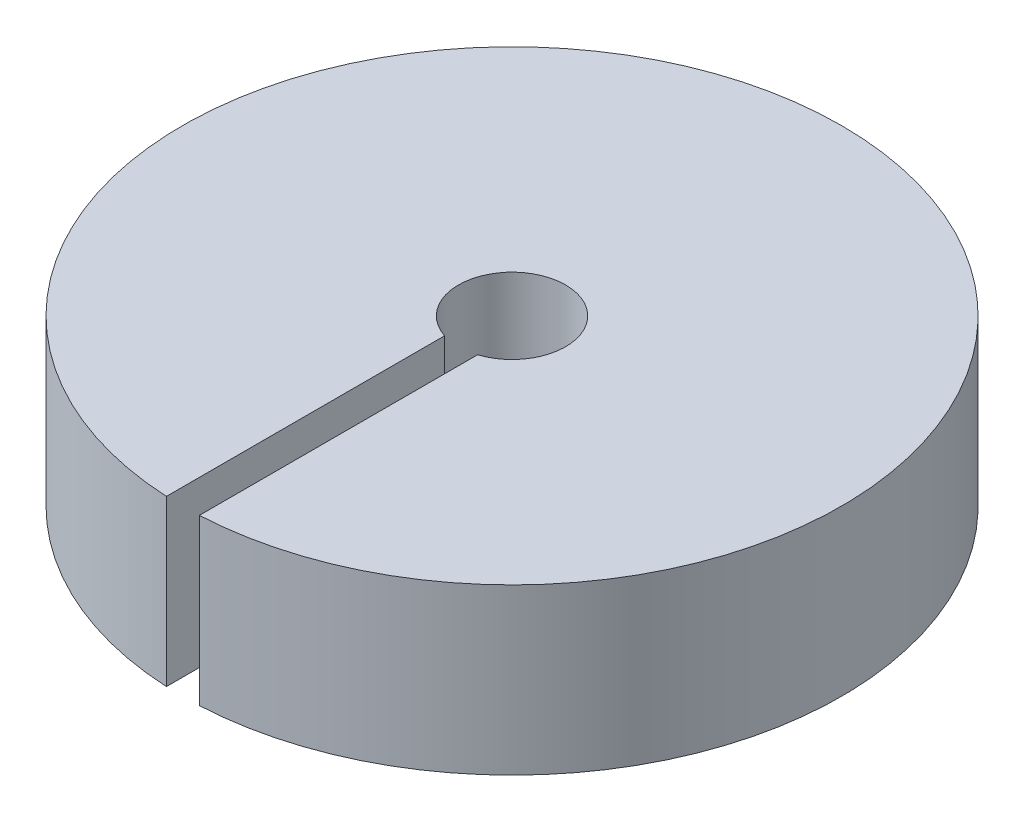
ISO-10303-21;
HEADER;
FILE_DESCRIPTION(('STEP AP214'),'2;1');
FILE_NAME('part.step','',(''),(''),'','','');
FILE_SCHEMA(('AUTOMOTIVE_DESIGN { 1 0 10303 214 1 1 1 1 }'));
ENDSEC;
DATA;
#1=APPLICATION_CONTEXT('core data for automotive mechanical design processes');
#2=APPLICATION_PROTOCOL_DEFINITION('international standard','automotive_design',2000,#1);
#3=PRODUCT_CONTEXT('',#1,'mechanical');
#4=PRODUCT('Part','Part','',(#3));
#5=PRODUCT_RELATED_PRODUCT_CATEGORY('part','',(#4));
#6=PRODUCT_DEFINITION_FORMATION('','',#4);
#7=PRODUCT_DEFINITION_CONTEXT('part definition',#1,'design');
#8=PRODUCT_DEFINITION('design','',#6,#7);
#9=PRODUCT_DEFINITION_SHAPE('','',#8);
#10=(LENGTH_UNIT() NAMED_UNIT(*) SI_UNIT(.MILLI.,.METRE.));
#11=(NAMED_UNIT(*) PLANE_ANGLE_UNIT() SI_UNIT($,.RADIAN.));
#12=(NAMED_UNIT(*) SI_UNIT($,.STERADIAN.) SOLID_ANGLE_UNIT());
#13=UNCERTAINTY_MEASURE_WITH_UNIT(LENGTH_MEASURE(1.E-05),#10,'distance_accuracy_value','');
#14=(GEOMETRIC_REPRESENTATION_CONTEXT(3) GLOBAL_UNCERTAINTY_ASSIGNED_CONTEXT((#13)) GLOBAL_UNIT_ASSIGNED_CONTEXT((#10,
#11,#12)) REPRESENTATION_CONTEXT('',''));
#15=CARTESIAN_POINT('',(0.,0.,0.));
#16=DIRECTION('',(0.,0.,1.));
#17=DIRECTION('',(1.,0.,0.));
#18=AXIS2_PLACEMENT_3D('',#15,#16,#17);
#19=CARTESIAN_POINT('',(0.,10.,0.));
#20=DIRECTION('',(0.,-1.,0.));
#21=DIRECTION('',(0.,0.,-1.));
#22=AXIS2_PLACEMENT_3D('',#19,#20,#21);
#23=CYLINDRICAL_SURFACE('',#22,20.);
#24=CARTESIAN_POINT('',(0.,0.,0.));
#25=DIRECTION('',(0.,1.,0.));
#26=DIRECTION('',(0.,0.,1.));
#27=AXIS2_PLACEMENT_3D('',#24,#25,#26);
#28=CIRCLE('',#27,20.);
#29=CARTESIAN_POINT('',(1.,0.,19.9749843554382));
#30=VERTEX_POINT('',#29);
#31=CARTESIAN_POINT('',(-1.,0.,19.9749843554382));
#32=VERTEX_POINT('',#31);
#33=EDGE_CURVE('E100',#30,#32,#28,.T.);
#34=ORIENTED_EDGE('',*,*,#33,.T.);
#35=DIRECTION('',(0.,-1.,0.));
#36=VECTOR('',#35,1.);
#37=CARTESIAN_POINT('',(-1.,10.,19.9749843554382));
#38=LINE('',#37,#36);
#39=CARTESIAN_POINT('',(-1.,10.,19.9749843554382));
#40=VERTEX_POINT('',#39);
#41=EDGE_CURVE('E11',#40,#32,#38,.T.);
#42=ORIENTED_EDGE('',*,*,#41,.F.);
#43=CARTESIAN_POINT('',(0.,10.,0.));
#44=DIRECTION('',(0.,1.,0.));
#45=DIRECTION('',(0.,0.,1.));
#46=AXIS2_PLACEMENT_3D('',#43,#44,#45);
#47=CIRCLE('',#46,20.);
#48=CARTESIAN_POINT('',(1.,10.,19.9749843554382));
#49=VERTEX_POINT('',#48);
#50=EDGE_CURVE('E88',#49,#40,#47,.T.);
#51=ORIENTED_EDGE('',*,*,#50,.F.);
#52=DIRECTION('',(0.,-1.,0.));
#53=VECTOR('',#52,1.);
#54=CARTESIAN_POINT('',(1.,10.,19.9749843554382));
#55=LINE('',#54,#53);
#56=EDGE_CURVE('E96',#49,#30,#55,.T.);
#57=ORIENTED_EDGE('',*,*,#56,.T.);
#58=EDGE_LOOP('',(#34,#42,#51,#57));
#59=FACE_BOUND('',#58,.T.);
#60=ADVANCED_FACE('F37',(#59),#23,.T.);
#61=CARTESIAN_POINT('',(-1.,10.,3.09232921921325));
#62=DIRECTION('',(-1.,0.,0.));
#63=DIRECTION('',(0.,0.,1.));
#64=AXIS2_PLACEMENT_3D('',#61,#62,#63);
#65=PLANE('',#64);
#66=DIRECTION('',(0.,0.,-1.));
#67=VECTOR('',#66,1.);
#68=CARTESIAN_POINT('',(-1.,0.,3.09232921921325));
#69=LINE('',#68,#67);
#70=CARTESIAN_POINT('',(-1.,0.,3.09232921921325));
#71=VERTEX_POINT('',#70);
#72=EDGE_CURVE('E92',#32,#71,#69,.T.);
#73=ORIENTED_EDGE('',*,*,#72,.T.);
#74=DIRECTION('',(0.,-1.,0.));
#75=VECTOR('',#74,1.);
#76=CARTESIAN_POINT('',(-1.,10.,3.09232921921325));
#77=LINE('',#76,#75);
#78=CARTESIAN_POINT('',(-1.,10.,3.09232921921325));
#79=VERTEX_POINT('',#78);
#80=EDGE_CURVE('E45',#79,#71,#77,.T.);
#81=ORIENTED_EDGE('',*,*,#80,.F.);
#82=DIRECTION('',(0.,0.,-1.));
#83=VECTOR('',#82,1.);
#84=CARTESIAN_POINT('',(-1.,10.,3.09232921921325));
#85=LINE('',#84,#83);
#86=EDGE_CURVE('E83',#40,#79,#85,.T.);
#87=ORIENTED_EDGE('',*,*,#86,.F.);
#88=ORIENTED_EDGE('',*,*,#41,.T.);
#89=EDGE_LOOP('',(#73,#81,#87,#88));
#90=FACE_BOUND('',#89,.T.);
#91=ADVANCED_FACE('F91',(#90),#65,.F.);
#92=CARTESIAN_POINT('',(0.,10.,0.));
#93=DIRECTION('',(0.,-1.,0.));
#94=DIRECTION('',(0.,0.,-1.));
#95=AXIS2_PLACEMENT_3D('',#92,#93,#94);
#96=CYLINDRICAL_SURFACE('',#95,3.25);
#97=CARTESIAN_POINT('',(0.,0.,0.));
#98=DIRECTION('',(0.,-1.,0.));
#99=DIRECTION('',(0.,0.,1.));
#100=AXIS2_PLACEMENT_3D('',#97,#98,#99);
#101=CIRCLE('',#100,3.25);
#102=CARTESIAN_POINT('',(1.,0.,3.09232921921325));
#103=VERTEX_POINT('',#102);
#104=EDGE_CURVE('E70',#71,#103,#101,.T.);
#105=ORIENTED_EDGE('',*,*,#104,.T.);
#106=DIRECTION('',(0.,-1.,0.));
#107=VECTOR('',#106,1.);
#108=CARTESIAN_POINT('',(1.,10.,3.09232921921325));
#109=LINE('',#108,#107);
#110=CARTESIAN_POINT('',(1.,10.,3.09232921921325));
#111=VERTEX_POINT('',#110);
#112=EDGE_CURVE('E93',#111,#103,#109,.T.);
#113=ORIENTED_EDGE('',*,*,#112,.F.);
#114=CARTESIAN_POINT('',(0.,10.,0.));
#115=DIRECTION('',(0.,-1.,0.));
#116=DIRECTION('',(0.,0.,1.));
#117=AXIS2_PLACEMENT_3D('',#114,#115,#116);
#118=CIRCLE('',#117,3.25);
#119=EDGE_CURVE('E86',#79,#111,#118,.T.);
#120=ORIENTED_EDGE('',*,*,#119,.F.);
#121=ORIENTED_EDGE('',*,*,#80,.T.);
#122=EDGE_LOOP('',(#105,#113,#120,#121));
#123=FACE_BOUND('',#122,.T.);
#124=ADVANCED_FACE('F94',(#123),#96,.F.);
#125=CARTESIAN_POINT('',(1.,10.,3.09232921921325));
#126=DIRECTION('',(1.,0.,0.));
#127=DIRECTION('',(0.,0.,-1.));
#128=AXIS2_PLACEMENT_3D('',#125,#126,#127);
#129=PLANE('',#128);
#130=DIRECTION('',(0.,0.,1.));
#131=VECTOR('',#130,1.);
#132=CARTESIAN_POINT('',(1.,0.,3.09232921921325));
#133=LINE('',#132,#131);
#134=EDGE_CURVE('E76',#103,#30,#133,.T.);
#135=ORIENTED_EDGE('',*,*,#134,.T.);
#136=ORIENTED_EDGE('',*,*,#56,.F.);
#137=DIRECTION('',(0.,0.,1.));
#138=VECTOR('',#137,1.);
#139=CARTESIAN_POINT('',(1.,10.,3.09232921921325));
#140=LINE('',#139,#138);
#141=EDGE_CURVE('E53',#111,#49,#140,.T.);
#142=ORIENTED_EDGE('',*,*,#141,.F.);
#143=ORIENTED_EDGE('',*,*,#112,.T.);
#144=EDGE_LOOP('',(#135,#136,#142,#143));
#145=FACE_BOUND('',#144,.T.);
#146=ADVANCED_FACE('F107',(#145),#129,.F.);
#147=CARTESIAN_POINT('',(0.,10.,0.));
#148=DIRECTION('',(0.,1.,0.));
#149=DIRECTION('',(0.,0.,1.));
#150=AXIS2_PLACEMENT_3D('',#147,#148,#149);
#151=PLANE('',#150);
#152=ORIENTED_EDGE('',*,*,#50,.T.);
#153=ORIENTED_EDGE('',*,*,#86,.T.);
#154=ORIENTED_EDGE('',*,*,#119,.T.);
#155=ORIENTED_EDGE('',*,*,#141,.T.);
#156=EDGE_LOOP('',(#152,#153,#154,#155));
#157=FACE_BOUND('',#156,.T.);
#158=ADVANCED_FACE('F84',(#157),#151,.T.);
#159=CARTESIAN_POINT('',(0.,0.,0.));
#160=DIRECTION('',(0.,1.,0.));
#161=DIRECTION('',(0.,0.,1.));
#162=AXIS2_PLACEMENT_3D('',#159,#160,#161);
#163=PLANE('',#162);
#164=ORIENTED_EDGE('',*,*,#33,.F.);
#165=ORIENTED_EDGE('',*,*,#134,.F.);
#166=ORIENTED_EDGE('',*,*,#104,.F.);
#167=ORIENTED_EDGE('',*,*,#72,.F.);
#168=EDGE_LOOP('',(#164,#165,#166,#167));
#169=FACE_BOUND('',#168,.T.);
#170=ADVANCED_FACE('F110',(#169),#163,.F.);
#171=CLOSED_SHELL('',(#60,#91,#124,#146,#158,#170));
#172=MANIFOLD_SOLID_BREP('B2',#171);
#173=ADVANCED_BREP_SHAPE_REPRESENTATION('',(#18,#172),#14);
#174=SHAPE_DEFINITION_REPRESENTATION(#9,#173);
ENDSEC;
END-ISO-10303-21;
